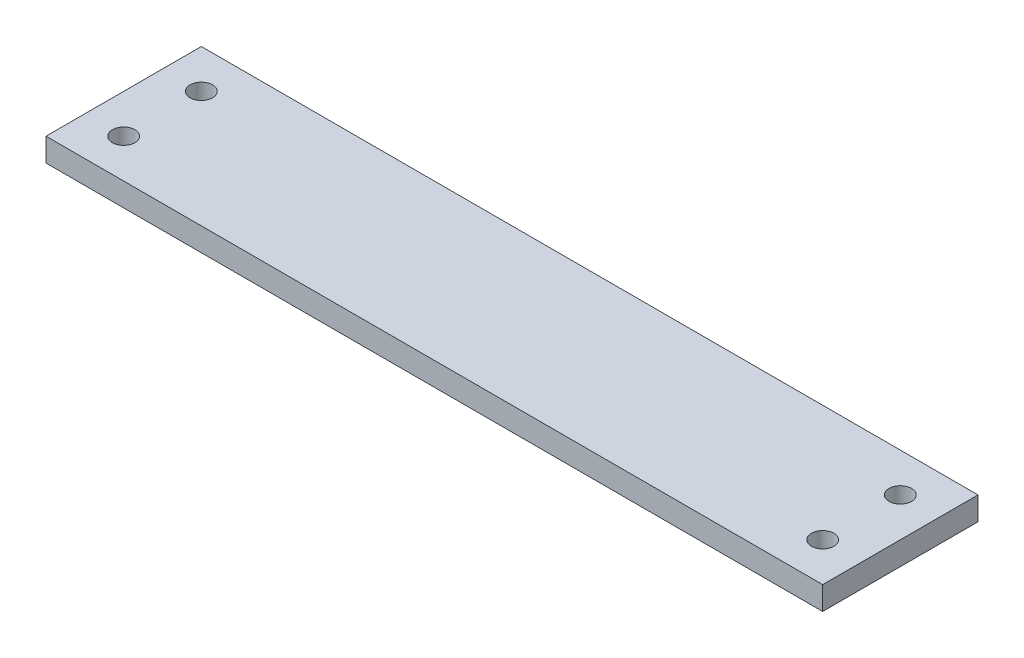
ISO-10303-21;
HEADER;
FILE_DESCRIPTION(('STEP AP214'),'2;1');
FILE_NAME('part.step','',(''),(''),'','','');
FILE_SCHEMA(('AUTOMOTIVE_DESIGN { 1 0 10303 214 1 1 1 1 }'));
ENDSEC;
DATA;
#1=APPLICATION_CONTEXT('core data for automotive mechanical design processes');
#2=APPLICATION_PROTOCOL_DEFINITION('international standard','automotive_design',2000,#1);
#3=PRODUCT_CONTEXT('',#1,'mechanical');
#4=PRODUCT('Part','Part','',(#3));
#5=PRODUCT_RELATED_PRODUCT_CATEGORY('part','',(#4));
#6=PRODUCT_DEFINITION_FORMATION('','',#4);
#7=PRODUCT_DEFINITION_CONTEXT('part definition',#1,'design');
#8=PRODUCT_DEFINITION('design','',#6,#7);
#9=PRODUCT_DEFINITION_SHAPE('','',#8);
#10=(LENGTH_UNIT() NAMED_UNIT(*) SI_UNIT(.MILLI.,.METRE.));
#11=(NAMED_UNIT(*) PLANE_ANGLE_UNIT() SI_UNIT($,.RADIAN.));
#12=(NAMED_UNIT(*) SI_UNIT($,.STERADIAN.) SOLID_ANGLE_UNIT());
#13=UNCERTAINTY_MEASURE_WITH_UNIT(LENGTH_MEASURE(1.E-05),#10,'distance_accuracy_value','');
#14=(GEOMETRIC_REPRESENTATION_CONTEXT(3) GLOBAL_UNCERTAINTY_ASSIGNED_CONTEXT((#13)) GLOBAL_UNIT_ASSIGNED_CONTEXT((#10,
#11,#12)) REPRESENTATION_CONTEXT('',''));
#15=CARTESIAN_POINT('',(0.,0.,0.));
#16=DIRECTION('',(0.,0.,1.));
#17=DIRECTION('',(1.,0.,0.));
#18=AXIS2_PLACEMENT_3D('',#15,#16,#17);
#19=CARTESIAN_POINT('',(0.,3.,0.));
#20=DIRECTION('',(-1.,0.,0.));
#21=DIRECTION('',(0.,0.,1.));
#22=AXIS2_PLACEMENT_3D('',#19,#20,#21);
#23=PLANE('',#22);
#24=DIRECTION('',(0.,0.,-1.));
#25=VECTOR('',#24,1.);
#26=CARTESIAN_POINT('',(0.,0.,0.));
#27=LINE('',#26,#25);
#28=CARTESIAN_POINT('',(0.,0.,0.));
#29=VERTEX_POINT('',#28);
#30=CARTESIAN_POINT('',(0.,0.,-20.));
#31=VERTEX_POINT('',#30);
#32=EDGE_CURVE('E103',#29,#31,#27,.T.);
#33=ORIENTED_EDGE('',*,*,#32,.T.);
#34=DIRECTION('',(0.,-1.,0.));
#35=VECTOR('',#34,1.);
#36=CARTESIAN_POINT('',(0.,3.,-20.));
#37=LINE('',#36,#35);
#38=CARTESIAN_POINT('',(0.,3.,-20.));
#39=VERTEX_POINT('',#38);
#40=EDGE_CURVE('E11',#39,#31,#37,.T.);
#41=ORIENTED_EDGE('',*,*,#40,.F.);
#42=DIRECTION('',(0.,0.,-1.));
#43=VECTOR('',#42,1.);
#44=CARTESIAN_POINT('',(0.,3.,0.));
#45=LINE('',#44,#43);
#46=CARTESIAN_POINT('',(0.,3.,0.));
#47=VERTEX_POINT('',#46);
#48=EDGE_CURVE('E90',#47,#39,#45,.T.);
#49=ORIENTED_EDGE('',*,*,#48,.F.);
#50=DIRECTION('',(0.,-1.,0.));
#51=VECTOR('',#50,1.);
#52=CARTESIAN_POINT('',(0.,3.,0.));
#53=LINE('',#52,#51);
#54=EDGE_CURVE('E99',#47,#29,#53,.T.);
#55=ORIENTED_EDGE('',*,*,#54,.T.);
#56=EDGE_LOOP('',(#33,#41,#49,#55));
#57=FACE_BOUND('',#56,.T.);
#58=ADVANCED_FACE('F37',(#57),#23,.F.);
#59=CARTESIAN_POINT('',(0.,3.,-20.));
#60=DIRECTION('',(0.,0.,1.));
#61=DIRECTION('',(1.,0.,0.));
#62=AXIS2_PLACEMENT_3D('',#59,#60,#61);
#63=PLANE('',#62);
#64=DIRECTION('',(-1.,0.,0.));
#65=VECTOR('',#64,1.);
#66=CARTESIAN_POINT('',(0.,0.,-20.));
#67=LINE('',#66,#65);
#68=CARTESIAN_POINT('',(-100.,0.,-20.));
#69=VERTEX_POINT('',#68);
#70=EDGE_CURVE('E94',#31,#69,#67,.T.);
#71=ORIENTED_EDGE('',*,*,#70,.T.);
#72=DIRECTION('',(0.,-1.,0.));
#73=VECTOR('',#72,1.);
#74=CARTESIAN_POINT('',(-100.,3.,-20.));
#75=LINE('',#74,#73);
#76=CARTESIAN_POINT('',(-100.,3.,-20.));
#77=VERTEX_POINT('',#76);
#78=EDGE_CURVE('E46',#77,#69,#75,.T.);
#79=ORIENTED_EDGE('',*,*,#78,.F.);
#80=DIRECTION('',(-1.,0.,0.));
#81=VECTOR('',#80,1.);
#82=CARTESIAN_POINT('',(0.,3.,-20.));
#83=LINE('',#82,#81);
#84=EDGE_CURVE('E85',#39,#77,#83,.T.);
#85=ORIENTED_EDGE('',*,*,#84,.F.);
#86=ORIENTED_EDGE('',*,*,#40,.T.);
#87=EDGE_LOOP('',(#71,#79,#85,#86));
#88=FACE_BOUND('',#87,.T.);
#89=ADVANCED_FACE('F93',(#88),#63,.F.);
#90=CARTESIAN_POINT('',(-100.,3.,0.));
#91=DIRECTION('',(1.,0.,0.));
#92=DIRECTION('',(0.,0.,-1.));
#93=AXIS2_PLACEMENT_3D('',#90,#91,#92);
#94=PLANE('',#93);
#95=DIRECTION('',(0.,0.,1.));
#96=VECTOR('',#95,1.);
#97=CARTESIAN_POINT('',(-100.,0.,0.));
#98=LINE('',#97,#96);
#99=CARTESIAN_POINT('',(-100.,0.,0.));
#100=VERTEX_POINT('',#99);
#101=EDGE_CURVE('E72',#69,#100,#98,.T.);
#102=ORIENTED_EDGE('',*,*,#101,.T.);
#103=DIRECTION('',(0.,-1.,0.));
#104=VECTOR('',#103,1.);
#105=CARTESIAN_POINT('',(-100.,3.,0.));
#106=LINE('',#105,#104);
#107=CARTESIAN_POINT('',(-100.,3.,0.));
#108=VERTEX_POINT('',#107);
#109=EDGE_CURVE('E95',#108,#100,#106,.T.);
#110=ORIENTED_EDGE('',*,*,#109,.F.);
#111=DIRECTION('',(0.,0.,1.));
#112=VECTOR('',#111,1.);
#113=CARTESIAN_POINT('',(-100.,3.,0.));
#114=LINE('',#113,#112);
#115=EDGE_CURVE('E88',#77,#108,#114,.T.);
#116=ORIENTED_EDGE('',*,*,#115,.F.);
#117=ORIENTED_EDGE('',*,*,#78,.T.);
#118=EDGE_LOOP('',(#102,#110,#116,#117));
#119=FACE_BOUND('',#118,.T.);
#120=ADVANCED_FACE('F97',(#119),#94,.F.);
#121=CARTESIAN_POINT('',(0.,3.,0.));
#122=DIRECTION('',(0.,0.,-1.));
#123=DIRECTION('',(-1.,0.,0.));
#124=AXIS2_PLACEMENT_3D('',#121,#122,#123);
#125=PLANE('',#124);
#126=DIRECTION('',(1.,0.,0.));
#127=VECTOR('',#126,1.);
#128=CARTESIAN_POINT('',(0.,0.,0.));
#129=LINE('',#128,#127);
#130=EDGE_CURVE('E78',#100,#29,#129,.T.);
#131=ORIENTED_EDGE('',*,*,#130,.T.);
#132=ORIENTED_EDGE('',*,*,#54,.F.);
#133=DIRECTION('',(1.,0.,0.));
#134=VECTOR('',#133,1.);
#135=CARTESIAN_POINT('',(0.,3.,0.));
#136=LINE('',#135,#134);
#137=EDGE_CURVE('E55',#108,#47,#136,.T.);
#138=ORIENTED_EDGE('',*,*,#137,.F.);
#139=ORIENTED_EDGE('',*,*,#109,.T.);
#140=EDGE_LOOP('',(#131,#132,#138,#139));
#141=FACE_BOUND('',#140,.T.);
#142=ADVANCED_FACE('F154',(#141),#125,.F.);
#143=CARTESIAN_POINT('',(0.,3.,0.));
#144=DIRECTION('',(0.,1.,0.));
#145=DIRECTION('',(0.,0.,1.));
#146=AXIS2_PLACEMENT_3D('',#143,#144,#145);
#147=PLANE('',#146);
#148=CARTESIAN_POINT('',(-5.,3.,-15.));
#149=DIRECTION('',(0.,1.,0.));
#150=DIRECTION('',(0.,0.,-1.));
#151=AXIS2_PLACEMENT_3D('',#148,#149,#150);
#152=CIRCLE('',#151,1.45);
#153=CARTESIAN_POINT('',(-5.,3.,-16.45));
#154=VERTEX_POINT('',#153);
#155=EDGE_CURVE('E221',#154,#154,#152,.T.);
#156=ORIENTED_EDGE('',*,*,#155,.F.);
#157=EDGE_LOOP('',(#156));
#158=FACE_BOUND('',#157,.T.);
#159=CARTESIAN_POINT('',(-5.,3.,-4.99999999999999));
#160=DIRECTION('',(0.,1.,0.));
#161=DIRECTION('',(0.,0.,1.));
#162=AXIS2_PLACEMENT_3D('',#159,#160,#161);
#163=CIRCLE('',#162,1.45);
#164=CARTESIAN_POINT('',(-5.,3.,-3.54999999999999));
#165=VERTEX_POINT('',#164);
#166=EDGE_CURVE('E216',#165,#165,#163,.T.);
#167=ORIENTED_EDGE('',*,*,#166,.F.);
#168=EDGE_LOOP('',(#167));
#169=FACE_BOUND('',#168,.T.);
#170=CARTESIAN_POINT('',(-95.,3.,-4.99999999999999));
#171=DIRECTION('',(0.,1.,0.));
#172=DIRECTION('',(0.,0.,-1.));
#173=AXIS2_PLACEMENT_3D('',#170,#171,#172);
#174=CIRCLE('',#173,1.45);
#175=CARTESIAN_POINT('',(-95.,3.,-6.44999999999999));
#176=VERTEX_POINT('',#175);
#177=EDGE_CURVE('E209',#176,#176,#174,.T.);
#178=ORIENTED_EDGE('',*,*,#177,.F.);
#179=EDGE_LOOP('',(#178));
#180=FACE_BOUND('',#179,.T.);
#181=CARTESIAN_POINT('',(-95.,3.,-15.));
#182=DIRECTION('',(0.,1.,0.));
#183=DIRECTION('',(0.,0.,1.));
#184=AXIS2_PLACEMENT_3D('',#181,#182,#183);
#185=CIRCLE('',#184,1.45);
#186=CARTESIAN_POINT('',(-95.,3.,-13.55));
#187=VERTEX_POINT('',#186);
#188=EDGE_CURVE('E115',#187,#187,#185,.T.);
#189=ORIENTED_EDGE('',*,*,#188,.F.);
#190=EDGE_LOOP('',(#189));
#191=FACE_BOUND('',#190,.T.);
#192=ORIENTED_EDGE('',*,*,#48,.T.);
#193=ORIENTED_EDGE('',*,*,#84,.T.);
#194=ORIENTED_EDGE('',*,*,#115,.T.);
#195=ORIENTED_EDGE('',*,*,#137,.T.);
#196=EDGE_LOOP('',(#192,#193,#194,#195));
#197=FACE_BOUND('',#196,.T.);
#198=ADVANCED_FACE('F86',(#158,#169,#180,#191,#197),#147,.T.);
#199=CARTESIAN_POINT('',(0.,0.,0.));
#200=DIRECTION('',(0.,1.,0.));
#201=DIRECTION('',(0.,0.,1.));
#202=AXIS2_PLACEMENT_3D('',#199,#200,#201);
#203=PLANE('',#202);
#204=CARTESIAN_POINT('',(-5.,0.,-15.));
#205=DIRECTION('',(0.,1.,0.));
#206=DIRECTION('',(0.,0.,1.));
#207=AXIS2_PLACEMENT_3D('',#204,#205,#206);
#208=CIRCLE('',#207,1.45);
#209=CARTESIAN_POINT('',(-5.,0.,-13.55));
#210=VERTEX_POINT('',#209);
#211=EDGE_CURVE('E40',#210,#210,#208,.T.);
#212=ORIENTED_EDGE('',*,*,#211,.T.);
#213=EDGE_LOOP('',(#212));
#214=FACE_BOUND('',#213,.T.);
#215=CARTESIAN_POINT('',(-5.,0.,-4.99999999999999));
#216=DIRECTION('',(0.,1.,0.));
#217=DIRECTION('',(0.,0.,1.));
#218=AXIS2_PLACEMENT_3D('',#215,#216,#217);
#219=CIRCLE('',#218,1.45);
#220=CARTESIAN_POINT('',(-5.,0.,-3.54999999999999));
#221=VERTEX_POINT('',#220);
#222=EDGE_CURVE('E117',#221,#221,#219,.T.);
#223=ORIENTED_EDGE('',*,*,#222,.T.);
#224=EDGE_LOOP('',(#223));
#225=FACE_BOUND('',#224,.T.);
#226=CARTESIAN_POINT('',(-95.,0.,-4.99999999999999));
#227=DIRECTION('',(0.,1.,0.));
#228=DIRECTION('',(0.,0.,1.));
#229=AXIS2_PLACEMENT_3D('',#226,#227,#228);
#230=CIRCLE('',#229,1.45);
#231=CARTESIAN_POINT('',(-95.,0.,-3.54999999999999));
#232=VERTEX_POINT('',#231);
#233=EDGE_CURVE('E114',#232,#232,#230,.T.);
#234=ORIENTED_EDGE('',*,*,#233,.T.);
#235=EDGE_LOOP('',(#234));
#236=FACE_BOUND('',#235,.T.);
#237=CARTESIAN_POINT('',(-95.,0.,-15.));
#238=DIRECTION('',(0.,1.,0.));
#239=DIRECTION('',(0.,0.,1.));
#240=AXIS2_PLACEMENT_3D('',#237,#238,#239);
#241=CIRCLE('',#240,1.45);
#242=CARTESIAN_POINT('',(-95.,0.,-13.55));
#243=VERTEX_POINT('',#242);
#244=EDGE_CURVE('E111',#243,#243,#241,.T.);
#245=ORIENTED_EDGE('',*,*,#244,.T.);
#246=EDGE_LOOP('',(#245));
#247=FACE_BOUND('',#246,.T.);
#248=ORIENTED_EDGE('',*,*,#32,.F.);
#249=ORIENTED_EDGE('',*,*,#130,.F.);
#250=ORIENTED_EDGE('',*,*,#101,.F.);
#251=ORIENTED_EDGE('',*,*,#70,.F.);
#252=EDGE_LOOP('',(#248,#249,#250,#251));
#253=FACE_BOUND('',#252,.T.);
#254=ADVANCED_FACE('F124',(#214,#225,#236,#247,#253),#203,.F.);
#255=CARTESIAN_POINT('',(-95.,-3.,-15.));
#256=DIRECTION('',(0.,1.,0.));
#257=DIRECTION('',(0.,0.,1.));
#258=AXIS2_PLACEMENT_3D('',#255,#256,#257);
#259=CYLINDRICAL_SURFACE('',#258,1.45);
#260=ORIENTED_EDGE('',*,*,#188,.T.);
#261=EDGE_LOOP('',(#260));
#262=FACE_BOUND('',#261,.T.);
#263=ORIENTED_EDGE('',*,*,#244,.F.);
#264=EDGE_LOOP('',(#263));
#265=FACE_BOUND('',#264,.T.);
#266=ADVANCED_FACE('F147',(#262,#265),#259,.F.);
#267=CARTESIAN_POINT('',(-95.,-3.,-4.99999999999999));
#268=DIRECTION('',(0.,1.,0.));
#269=DIRECTION('',(0.,0.,1.));
#270=AXIS2_PLACEMENT_3D('',#267,#268,#269);
#271=CYLINDRICAL_SURFACE('',#270,1.45);
#272=ORIENTED_EDGE('',*,*,#177,.T.);
#273=EDGE_LOOP('',(#272));
#274=FACE_BOUND('',#273,.T.);
#275=ORIENTED_EDGE('',*,*,#233,.F.);
#276=EDGE_LOOP('',(#275));
#277=FACE_BOUND('',#276,.T.);
#278=ADVANCED_FACE('F134',(#274,#277),#271,.F.);
#279=CARTESIAN_POINT('',(-5.,-3.,-4.99999999999999));
#280=DIRECTION('',(0.,1.,0.));
#281=DIRECTION('',(0.,0.,1.));
#282=AXIS2_PLACEMENT_3D('',#279,#280,#281);
#283=CYLINDRICAL_SURFACE('',#282,1.45);
#284=ORIENTED_EDGE('',*,*,#166,.T.);
#285=EDGE_LOOP('',(#284));
#286=FACE_BOUND('',#285,.T.);
#287=ORIENTED_EDGE('',*,*,#222,.F.);
#288=EDGE_LOOP('',(#287));
#289=FACE_BOUND('',#288,.T.);
#290=ADVANCED_FACE('F128',(#286,#289),#283,.F.);
#291=CARTESIAN_POINT('',(-5.,-3.,-15.));
#292=DIRECTION('',(0.,1.,0.));
#293=DIRECTION('',(0.,0.,1.));
#294=AXIS2_PLACEMENT_3D('',#291,#292,#293);
#295=CYLINDRICAL_SURFACE('',#294,1.45);
#296=ORIENTED_EDGE('',*,*,#155,.T.);
#297=EDGE_LOOP('',(#296));
#298=FACE_BOUND('',#297,.T.);
#299=ORIENTED_EDGE('',*,*,#211,.F.);
#300=EDGE_LOOP('',(#299));
#301=FACE_BOUND('',#300,.T.);
#302=ADVANCED_FACE('F126',(#298,#301),#295,.F.);
#303=CLOSED_SHELL('',(#58,#89,#120,#142,#198,#254,#266,#278,#290,#302));
#304=MANIFOLD_SOLID_BREP('B2',#303);
#305=ADVANCED_BREP_SHAPE_REPRESENTATION('',(#18,#304),#14);
#306=SHAPE_DEFINITION_REPRESENTATION(#9,#305);
ENDSEC;
END-ISO-10303-21;
